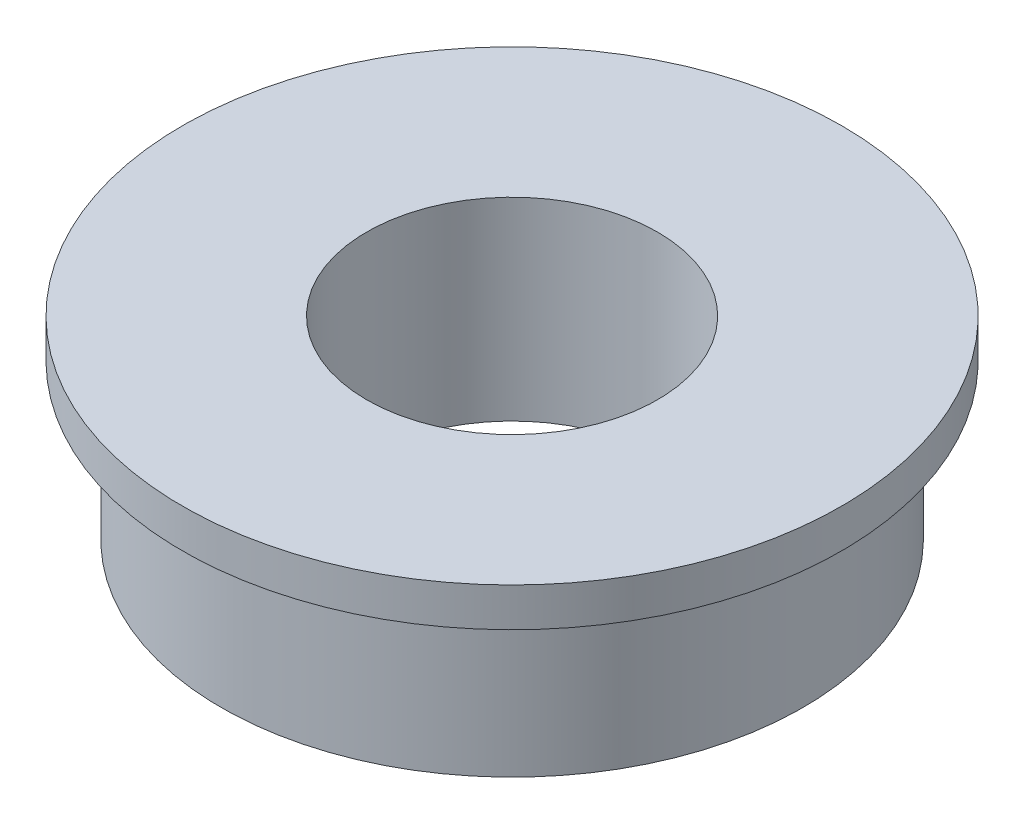
ISO-10303-21;
HEADER;
FILE_DESCRIPTION(('STEP AP214'),'2;1');
FILE_NAME('part.step','',(''),(''),'','','');
FILE_SCHEMA(('AUTOMOTIVE_DESIGN { 1 0 10303 214 1 1 1 1 }'));
ENDSEC;
DATA;
#1=APPLICATION_CONTEXT('core data for automotive mechanical design processes');
#2=APPLICATION_PROTOCOL_DEFINITION('international standard','automotive_design',2000,#1);
#3=PRODUCT_CONTEXT('',#1,'mechanical');
#4=PRODUCT('Part','Part','',(#3));
#5=PRODUCT_RELATED_PRODUCT_CATEGORY('part','',(#4));
#6=PRODUCT_DEFINITION_FORMATION('','',#4);
#7=PRODUCT_DEFINITION_CONTEXT('part definition',#1,'design');
#8=PRODUCT_DEFINITION('design','',#6,#7);
#9=PRODUCT_DEFINITION_SHAPE('','',#8);
#10=(LENGTH_UNIT() NAMED_UNIT(*) SI_UNIT(.MILLI.,.METRE.));
#11=(NAMED_UNIT(*) PLANE_ANGLE_UNIT() SI_UNIT($,.RADIAN.));
#12=(NAMED_UNIT(*) SI_UNIT($,.STERADIAN.) SOLID_ANGLE_UNIT());
#13=UNCERTAINTY_MEASURE_WITH_UNIT(LENGTH_MEASURE(1.E-05),#10,'distance_accuracy_value','');
#14=(GEOMETRIC_REPRESENTATION_CONTEXT(3) GLOBAL_UNCERTAINTY_ASSIGNED_CONTEXT((#13)) GLOBAL_UNIT_ASSIGNED_CONTEXT((#10,
#11,#12)) REPRESENTATION_CONTEXT('',''));
#15=CARTESIAN_POINT('',(0.,0.,0.));
#16=DIRECTION('',(0.,0.,1.));
#17=DIRECTION('',(1.,0.,0.));
#18=AXIS2_PLACEMENT_3D('',#15,#16,#17);
#19=CARTESIAN_POINT('',(6.8,4.,0.));
#20=DIRECTION('',(0.,1.,0.));
#21=DIRECTION('',(0.,0.,1.));
#22=AXIS2_PLACEMENT_3D('',#19,#20,#21);
#23=PLANE('',#22);
#24=CARTESIAN_POINT('',(0.,4.,0.));
#25=DIRECTION('',(0.,-1.,0.));
#26=DIRECTION('',(0.,0.,-1.));
#27=AXIS2_PLACEMENT_3D('',#24,#25,#26);
#28=CIRCLE('',#27,3.);
#29=CARTESIAN_POINT('',(0.,4.,-3.));
#30=VERTEX_POINT('',#29);
#31=EDGE_CURVE('E10',#30,#30,#28,.T.);
#32=ORIENTED_EDGE('',*,*,#31,.T.);
#33=EDGE_LOOP('',(#32));
#34=FACE_BOUND('',#33,.T.);
#35=CARTESIAN_POINT('',(0.,4.,0.));
#36=DIRECTION('',(0.,-1.,0.));
#37=DIRECTION('',(0.,0.,-1.));
#38=AXIS2_PLACEMENT_3D('',#35,#36,#37);
#39=CIRCLE('',#38,6.8);
#40=CARTESIAN_POINT('',(0.,4.,-6.8));
#41=VERTEX_POINT('',#40);
#42=EDGE_CURVE('E54',#41,#41,#39,.T.);
#43=ORIENTED_EDGE('',*,*,#42,.F.);
#44=EDGE_LOOP('',(#43));
#45=FACE_BOUND('',#44,.T.);
#46=ADVANCED_FACE('F32',(#34,#45),#23,.T.);
#47=CARTESIAN_POINT('',(0.,0.,0.));
#48=DIRECTION('',(0.,-1.,0.));
#49=DIRECTION('',(0.,0.,-1.));
#50=AXIS2_PLACEMENT_3D('',#47,#48,#49);
#51=CYLINDRICAL_SURFACE('',#50,3.);
#52=CARTESIAN_POINT('',(0.,0.,0.));
#53=DIRECTION('',(0.,-1.,0.));
#54=DIRECTION('',(0.,0.,-1.));
#55=AXIS2_PLACEMENT_3D('',#52,#53,#54);
#56=CIRCLE('',#55,3.);
#57=CARTESIAN_POINT('',(0.,0.,-3.));
#58=VERTEX_POINT('',#57);
#59=EDGE_CURVE('E38',#58,#58,#56,.T.);
#60=ORIENTED_EDGE('',*,*,#59,.T.);
#61=EDGE_LOOP('',(#60));
#62=FACE_BOUND('',#61,.T.);
#63=ORIENTED_EDGE('',*,*,#31,.F.);
#64=EDGE_LOOP('',(#63));
#65=FACE_BOUND('',#64,.T.);
#66=ADVANCED_FACE('F62',(#62,#65),#51,.F.);
#67=CARTESIAN_POINT('',(3.,0.,0.));
#68=DIRECTION('',(0.,-1.,0.));
#69=DIRECTION('',(0.,0.,-1.));
#70=AXIS2_PLACEMENT_3D('',#67,#68,#69);
#71=PLANE('',#70);
#72=CARTESIAN_POINT('',(0.,0.,0.));
#73=DIRECTION('',(0.,-1.,0.));
#74=DIRECTION('',(0.,0.,-1.));
#75=AXIS2_PLACEMENT_3D('',#72,#73,#74);
#76=CIRCLE('',#75,6.);
#77=CARTESIAN_POINT('',(0.,0.,-6.));
#78=VERTEX_POINT('',#77);
#79=EDGE_CURVE('E42',#78,#78,#76,.T.);
#80=ORIENTED_EDGE('',*,*,#79,.T.);
#81=EDGE_LOOP('',(#80));
#82=FACE_BOUND('',#81,.T.);
#83=ORIENTED_EDGE('',*,*,#59,.F.);
#84=EDGE_LOOP('',(#83));
#85=FACE_BOUND('',#84,.T.);
#86=ADVANCED_FACE('F66',(#82,#85),#71,.T.);
#87=CARTESIAN_POINT('',(0.,0.,0.));
#88=DIRECTION('',(0.,-1.,0.));
#89=DIRECTION('',(0.,0.,-1.));
#90=AXIS2_PLACEMENT_3D('',#87,#88,#89);
#91=CYLINDRICAL_SURFACE('',#90,6.);
#92=CARTESIAN_POINT('',(0.,3.2,0.));
#93=DIRECTION('',(0.,-1.,0.));
#94=DIRECTION('',(0.,0.,-1.));
#95=AXIS2_PLACEMENT_3D('',#92,#93,#94);
#96=CIRCLE('',#95,6.);
#97=CARTESIAN_POINT('',(0.,3.2,-6.));
#98=VERTEX_POINT('',#97);
#99=EDGE_CURVE('E46',#98,#98,#96,.T.);
#100=ORIENTED_EDGE('',*,*,#99,.T.);
#101=EDGE_LOOP('',(#100));
#102=FACE_BOUND('',#101,.T.);
#103=ORIENTED_EDGE('',*,*,#79,.F.);
#104=EDGE_LOOP('',(#103));
#105=FACE_BOUND('',#104,.T.);
#106=ADVANCED_FACE('F70',(#102,#105),#91,.T.);
#107=CARTESIAN_POINT('',(6.,3.2,0.));
#108=DIRECTION('',(0.,-1.,0.));
#109=DIRECTION('',(0.,0.,-1.));
#110=AXIS2_PLACEMENT_3D('',#107,#108,#109);
#111=PLANE('',#110);
#112=CARTESIAN_POINT('',(0.,3.2,0.));
#113=DIRECTION('',(0.,-1.,0.));
#114=DIRECTION('',(0.,0.,-1.));
#115=AXIS2_PLACEMENT_3D('',#112,#113,#114);
#116=CIRCLE('',#115,6.8);
#117=CARTESIAN_POINT('',(0.,3.2,-6.8));
#118=VERTEX_POINT('',#117);
#119=EDGE_CURVE('E51',#118,#118,#116,.T.);
#120=ORIENTED_EDGE('',*,*,#119,.T.);
#121=EDGE_LOOP('',(#120));
#122=FACE_BOUND('',#121,.T.);
#123=ORIENTED_EDGE('',*,*,#99,.F.);
#124=EDGE_LOOP('',(#123));
#125=FACE_BOUND('',#124,.T.);
#126=ADVANCED_FACE('F77',(#122,#125),#111,.T.);
#127=CARTESIAN_POINT('',(0.,0.,0.));
#128=DIRECTION('',(0.,-1.,0.));
#129=DIRECTION('',(0.,0.,-1.));
#130=AXIS2_PLACEMENT_3D('',#127,#128,#129);
#131=CYLINDRICAL_SURFACE('',#130,6.8);
#132=ORIENTED_EDGE('',*,*,#42,.T.);
#133=EDGE_LOOP('',(#132));
#134=FACE_BOUND('',#133,.T.);
#135=ORIENTED_EDGE('',*,*,#119,.F.);
#136=EDGE_LOOP('',(#135));
#137=FACE_BOUND('',#136,.T.);
#138=ADVANCED_FACE('F58',(#134,#137),#131,.T.);
#139=CLOSED_SHELL('',(#46,#66,#86,#106,#126,#138));
#140=MANIFOLD_SOLID_BREP('B2',#139);
#141=ADVANCED_BREP_SHAPE_REPRESENTATION('',(#18,#140),#14);
#142=SHAPE_DEFINITION_REPRESENTATION(#9,#141);
ENDSEC;
END-ISO-10303-21;
